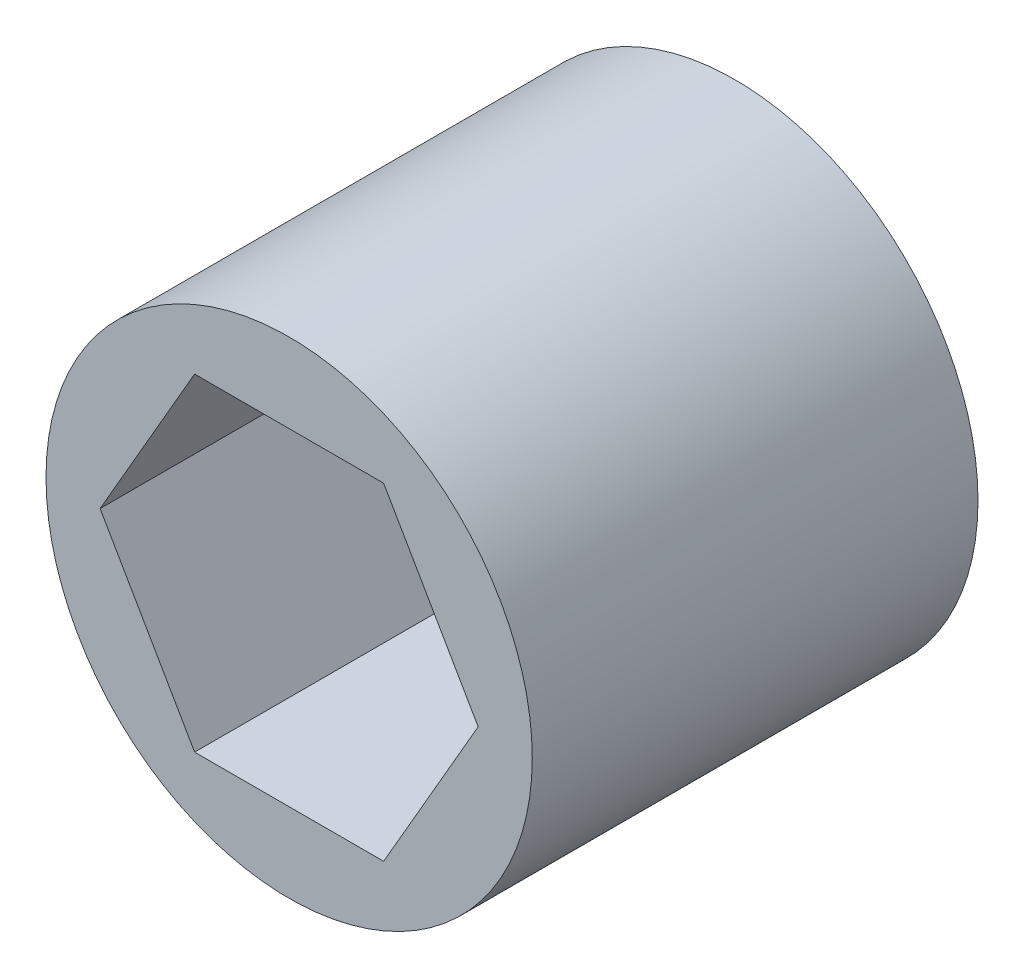
ISO-10303-21;
HEADER;
FILE_DESCRIPTION(('STEP AP214'),'2;1');
FILE_NAME('part.step','',(''),(''),'','','');
FILE_SCHEMA(('AUTOMOTIVE_DESIGN { 1 0 10303 214 1 1 1 1 }'));
ENDSEC;
DATA;
#1=APPLICATION_CONTEXT('core data for automotive mechanical design processes');
#2=APPLICATION_PROTOCOL_DEFINITION('international standard','automotive_design',2000,#1);
#3=PRODUCT_CONTEXT('',#1,'mechanical');
#4=PRODUCT('Part','Part','',(#3));
#5=PRODUCT_RELATED_PRODUCT_CATEGORY('part','',(#4));
#6=PRODUCT_DEFINITION_FORMATION('','',#4);
#7=PRODUCT_DEFINITION_CONTEXT('part definition',#1,'design');
#8=PRODUCT_DEFINITION('design','',#6,#7);
#9=PRODUCT_DEFINITION_SHAPE('','',#8);
#10=(LENGTH_UNIT() NAMED_UNIT(*) SI_UNIT(.MILLI.,.METRE.));
#11=(NAMED_UNIT(*) PLANE_ANGLE_UNIT() SI_UNIT($,.RADIAN.));
#12=(NAMED_UNIT(*) SI_UNIT($,.STERADIAN.) SOLID_ANGLE_UNIT());
#13=UNCERTAINTY_MEASURE_WITH_UNIT(LENGTH_MEASURE(1.E-05),#10,'distance_accuracy_value','');
#14=(GEOMETRIC_REPRESENTATION_CONTEXT(3) GLOBAL_UNCERTAINTY_ASSIGNED_CONTEXT((#13)) GLOBAL_UNIT_ASSIGNED_CONTEXT((#10,
#11,#12)) REPRESENTATION_CONTEXT('',''));
#15=CARTESIAN_POINT('',(0.,0.,0.));
#16=DIRECTION('',(0.,0.,1.));
#17=DIRECTION('',(1.,0.,0.));
#18=AXIS2_PLACEMENT_3D('',#15,#16,#17);
#19=CARTESIAN_POINT('',(0.,0.,17.4625));
#20=DIRECTION('',(0.,0.,-1.));
#21=DIRECTION('',(-1.,0.,0.));
#22=AXIS2_PLACEMENT_3D('',#19,#20,#21);
#23=CYLINDRICAL_SURFACE('',#22,9.525);
#24=CARTESIAN_POINT('',(0.,0.,17.4625));
#25=DIRECTION('',(0.,0.,1.));
#26=DIRECTION('',(1.,0.,0.));
#27=AXIS2_PLACEMENT_3D('',#24,#25,#26);
#28=CIRCLE('',#27,9.525);
#29=CARTESIAN_POINT('',(9.525,0.,17.4625));
#30=VERTEX_POINT('',#29);
#31=EDGE_CURVE('E11',#30,#30,#28,.T.);
#32=ORIENTED_EDGE('',*,*,#31,.F.);
#33=EDGE_LOOP('',(#32));
#34=FACE_BOUND('',#33,.T.);
#35=CARTESIAN_POINT('',(0.,0.,0.));
#36=DIRECTION('',(0.,0.,1.));
#37=DIRECTION('',(1.,0.,0.));
#38=AXIS2_PLACEMENT_3D('',#35,#36,#37);
#39=CIRCLE('',#38,9.525);
#40=CARTESIAN_POINT('',(9.525,0.,0.));
#41=VERTEX_POINT('',#40);
#42=EDGE_CURVE('E20',#41,#41,#39,.T.);
#43=ORIENTED_EDGE('',*,*,#42,.T.);
#44=EDGE_LOOP('',(#43));
#45=FACE_BOUND('',#44,.T.);
#46=ADVANCED_FACE('F17',(#34,#45),#23,.T.);
#47=CARTESIAN_POINT('',(0.,0.,17.4625));
#48=DIRECTION('',(0.,0.,1.));
#49=DIRECTION('',(1.,0.,0.));
#50=AXIS2_PLACEMENT_3D('',#47,#48,#49);
#51=PLANE('',#50);
#52=DIRECTION('',(-0.5,0.866025403784439,0.));
#53=VECTOR('',#52,1.);
#54=CARTESIAN_POINT('',(5.5542539271715,3.20675,17.4625));
#55=LINE('',#54,#53);
#56=CARTESIAN_POINT('',(7.40567190289533,0.,17.4625));
#57=VERTEX_POINT('',#56);
#58=CARTESIAN_POINT('',(3.70283595144766,6.4135,17.4625));
#59=VERTEX_POINT('',#58);
#60=EDGE_CURVE('E87',#57,#59,#55,.T.);
#61=ORIENTED_EDGE('',*,*,#60,.F.);
#62=DIRECTION('',(0.5,0.866025403784438,0.));
#63=VECTOR('',#62,1.);
#64=CARTESIAN_POINT('',(5.5542539271715,-3.20675,17.4625));
#65=LINE('',#64,#63);
#66=CARTESIAN_POINT('',(3.70283595144766,-6.4135,17.4625));
#67=VERTEX_POINT('',#66);
#68=EDGE_CURVE('E112',#67,#57,#65,.T.);
#69=ORIENTED_EDGE('',*,*,#68,.F.);
#70=DIRECTION('',(1.,0.,0.));
#71=VECTOR('',#70,1.);
#72=CARTESIAN_POINT('',(0.,-6.4135,17.4625));
#73=LINE('',#72,#71);
#74=CARTESIAN_POINT('',(-3.70283595144766,-6.4135,17.4625));
#75=VERTEX_POINT('',#74);
#76=EDGE_CURVE('E32',#75,#67,#73,.T.);
#77=ORIENTED_EDGE('',*,*,#76,.F.);
#78=DIRECTION('',(0.5,-0.866025403784439,0.));
#79=VECTOR('',#78,1.);
#80=CARTESIAN_POINT('',(-5.5542539271715,-3.20675,17.4625));
#81=LINE('',#80,#79);
#82=CARTESIAN_POINT('',(-7.40567190289533,0.,17.4625));
#83=VERTEX_POINT('',#82);
#84=EDGE_CURVE('E104',#83,#75,#81,.T.);
#85=ORIENTED_EDGE('',*,*,#84,.F.);
#86=DIRECTION('',(-0.5,-0.866025403784439,0.));
#87=VECTOR('',#86,1.);
#88=CARTESIAN_POINT('',(-5.5542539271715,3.20675,17.4625));
#89=LINE('',#88,#87);
#90=CARTESIAN_POINT('',(-3.70283595144766,6.4135,17.4625));
#91=VERTEX_POINT('',#90);
#92=EDGE_CURVE('E97',#91,#83,#89,.T.);
#93=ORIENTED_EDGE('',*,*,#92,.F.);
#94=DIRECTION('',(-1.,0.,0.));
#95=VECTOR('',#94,1.);
#96=CARTESIAN_POINT('',(0.,6.4135,17.4625));
#97=LINE('',#96,#95);
#98=EDGE_CURVE('E76',#59,#91,#97,.T.);
#99=ORIENTED_EDGE('',*,*,#98,.F.);
#100=EDGE_LOOP('',(#61,#69,#77,#85,#93,#99));
#101=FACE_BOUND('',#100,.T.);
#102=ORIENTED_EDGE('',*,*,#31,.T.);
#103=EDGE_LOOP('',(#102));
#104=FACE_BOUND('',#103,.T.);
#105=ADVANCED_FACE('F93',(#101,#104),#51,.T.);
#106=CARTESIAN_POINT('',(0.,0.,0.));
#107=DIRECTION('',(0.,0.,1.));
#108=DIRECTION('',(1.,0.,0.));
#109=AXIS2_PLACEMENT_3D('',#106,#107,#108);
#110=PLANE('',#109);
#111=DIRECTION('',(-0.5,-0.866025403784439,0.));
#112=VECTOR('',#111,1.);
#113=CARTESIAN_POINT('',(5.5542539271715,-3.20675,0.));
#114=LINE('',#113,#112);
#115=CARTESIAN_POINT('',(7.40567190289533,0.,0.));
#116=VERTEX_POINT('',#115);
#117=CARTESIAN_POINT('',(3.70283595144766,-6.4135,0.));
#118=VERTEX_POINT('',#117);
#119=EDGE_CURVE('E128',#116,#118,#114,.T.);
#120=ORIENTED_EDGE('',*,*,#119,.F.);
#121=DIRECTION('',(0.5,-0.866025403784439,0.));
#122=VECTOR('',#121,1.);
#123=CARTESIAN_POINT('',(5.5542539271715,3.20675,0.));
#124=LINE('',#123,#122);
#125=CARTESIAN_POINT('',(3.70283595144766,6.4135,0.));
#126=VERTEX_POINT('',#125);
#127=EDGE_CURVE('E83',#126,#116,#124,.T.);
#128=ORIENTED_EDGE('',*,*,#127,.F.);
#129=DIRECTION('',(1.,0.,0.));
#130=VECTOR('',#129,1.);
#131=CARTESIAN_POINT('',(0.,6.4135,0.));
#132=LINE('',#131,#130);
#133=CARTESIAN_POINT('',(-3.70283595144766,6.4135,0.));
#134=VERTEX_POINT('',#133);
#135=EDGE_CURVE('E79',#134,#126,#132,.T.);
#136=ORIENTED_EDGE('',*,*,#135,.F.);
#137=DIRECTION('',(0.5,0.866025403784439,0.));
#138=VECTOR('',#137,1.);
#139=CARTESIAN_POINT('',(-5.5542539271715,3.20675,0.));
#140=LINE('',#139,#138);
#141=CARTESIAN_POINT('',(-7.40567190289533,0.,0.));
#142=VERTEX_POINT('',#141);
#143=EDGE_CURVE('E137',#142,#134,#140,.T.);
#144=ORIENTED_EDGE('',*,*,#143,.F.);
#145=DIRECTION('',(-0.5,0.866025403784439,0.));
#146=VECTOR('',#145,1.);
#147=CARTESIAN_POINT('',(-5.5542539271715,-3.20675,0.));
#148=LINE('',#147,#146);
#149=CARTESIAN_POINT('',(-3.70283595144766,-6.4135,0.));
#150=VERTEX_POINT('',#149);
#151=EDGE_CURVE('E134',#150,#142,#148,.T.);
#152=ORIENTED_EDGE('',*,*,#151,.F.);
#153=DIRECTION('',(-1.,0.,0.));
#154=VECTOR('',#153,1.);
#155=CARTESIAN_POINT('',(0.,-6.4135,0.));
#156=LINE('',#155,#154);
#157=EDGE_CURVE('E131',#118,#150,#156,.T.);
#158=ORIENTED_EDGE('',*,*,#157,.F.);
#159=EDGE_LOOP('',(#120,#128,#136,#144,#152,#158));
#160=FACE_BOUND('',#159,.T.);
#161=ORIENTED_EDGE('',*,*,#42,.F.);
#162=EDGE_LOOP('',(#161));
#163=FACE_BOUND('',#162,.T.);
#164=ADVANCED_FACE('F144',(#160,#163),#110,.F.);
#165=CARTESIAN_POINT('',(5.5542539271715,3.20675,-0.00199999999999853));
#166=DIRECTION('',(0.866025403784439,0.5,0.));
#167=DIRECTION('',(-0.5,0.866025403784439,0.));
#168=AXIS2_PLACEMENT_3D('',#165,#166,#167);
#169=PLANE('',#168);
#170=ORIENTED_EDGE('',*,*,#127,.T.);
#171=DIRECTION('',(0.,0.,1.));
#172=VECTOR('',#171,1.);
#173=CARTESIAN_POINT('',(7.40567190289533,0.,-0.00199999999999853));
#174=LINE('',#173,#172);
#175=EDGE_CURVE('E40',#116,#57,#174,.T.);
#176=ORIENTED_EDGE('',*,*,#175,.T.);
#177=ORIENTED_EDGE('',*,*,#60,.T.);
#178=DIRECTION('',(0.,0.,1.));
#179=VECTOR('',#178,1.);
#180=CARTESIAN_POINT('',(3.70283595144766,6.4135,-0.00199999999999853));
#181=LINE('',#180,#179);
#182=EDGE_CURVE('E71',#126,#59,#181,.T.);
#183=ORIENTED_EDGE('',*,*,#182,.F.);
#184=EDGE_LOOP('',(#170,#176,#177,#183));
#185=FACE_BOUND('',#184,.T.);
#186=ADVANCED_FACE('F88',(#185),#169,.F.);
#187=CARTESIAN_POINT('',(0.,6.4135,-0.00199999999999853));
#188=DIRECTION('',(0.,1.,0.));
#189=DIRECTION('',(0.,0.,1.));
#190=AXIS2_PLACEMENT_3D('',#187,#188,#189);
#191=PLANE('',#190);
#192=ORIENTED_EDGE('',*,*,#135,.T.);
#193=ORIENTED_EDGE('',*,*,#182,.T.);
#194=ORIENTED_EDGE('',*,*,#98,.T.);
#195=DIRECTION('',(0.,0.,1.));
#196=VECTOR('',#195,1.);
#197=CARTESIAN_POINT('',(-3.70283595144766,6.4135,-0.00199999999999853));
#198=LINE('',#197,#196);
#199=EDGE_CURVE('E84',#134,#91,#198,.T.);
#200=ORIENTED_EDGE('',*,*,#199,.F.);
#201=EDGE_LOOP('',(#192,#193,#194,#200));
#202=FACE_BOUND('',#201,.T.);
#203=ADVANCED_FACE('F73',(#202),#191,.F.);
#204=CARTESIAN_POINT('',(-5.5542539271715,3.20675,-0.00199999999999853));
#205=DIRECTION('',(-0.866025403784439,0.5,0.));
#206=DIRECTION('',(-0.5,-0.866025403784439,0.));
#207=AXIS2_PLACEMENT_3D('',#204,#205,#206);
#208=PLANE('',#207);
#209=ORIENTED_EDGE('',*,*,#143,.T.);
#210=ORIENTED_EDGE('',*,*,#199,.T.);
#211=ORIENTED_EDGE('',*,*,#92,.T.);
#212=DIRECTION('',(0.,0.,1.));
#213=VECTOR('',#212,1.);
#214=CARTESIAN_POINT('',(-7.40567190289533,0.,-0.00199999999999853));
#215=LINE('',#214,#213);
#216=EDGE_CURVE('E123',#142,#83,#215,.T.);
#217=ORIENTED_EDGE('',*,*,#216,.F.);
#218=EDGE_LOOP('',(#209,#210,#211,#217));
#219=FACE_BOUND('',#218,.T.);
#220=ADVANCED_FACE('F155',(#219),#208,.F.);
#221=CARTESIAN_POINT('',(-5.5542539271715,-3.20675,-0.00199999999999853));
#222=DIRECTION('',(-0.866025403784439,-0.5,0.));
#223=DIRECTION('',(0.5,-0.866025403784439,0.));
#224=AXIS2_PLACEMENT_3D('',#221,#222,#223);
#225=PLANE('',#224);
#226=ORIENTED_EDGE('',*,*,#151,.T.);
#227=ORIENTED_EDGE('',*,*,#216,.T.);
#228=ORIENTED_EDGE('',*,*,#84,.T.);
#229=DIRECTION('',(0.,0.,1.));
#230=VECTOR('',#229,1.);
#231=CARTESIAN_POINT('',(-3.70283595144766,-6.4135,-0.00199999999999853));
#232=LINE('',#231,#230);
#233=EDGE_CURVE('E120',#150,#75,#232,.T.);
#234=ORIENTED_EDGE('',*,*,#233,.F.);
#235=EDGE_LOOP('',(#226,#227,#228,#234));
#236=FACE_BOUND('',#235,.T.);
#237=ADVANCED_FACE('F151',(#236),#225,.F.);
#238=CARTESIAN_POINT('',(0.,-6.4135,-0.00199999999999853));
#239=DIRECTION('',(0.,-1.,0.));
#240=DIRECTION('',(1.,0.,0.));
#241=AXIS2_PLACEMENT_3D('',#238,#239,#240);
#242=PLANE('',#241);
#243=ORIENTED_EDGE('',*,*,#157,.T.);
#244=ORIENTED_EDGE('',*,*,#233,.T.);
#245=ORIENTED_EDGE('',*,*,#76,.T.);
#246=DIRECTION('',(0.,0.,1.));
#247=VECTOR('',#246,1.);
#248=CARTESIAN_POINT('',(3.70283595144766,-6.4135,-0.00199999999999853));
#249=LINE('',#248,#247);
#250=EDGE_CURVE('E117',#118,#67,#249,.T.);
#251=ORIENTED_EDGE('',*,*,#250,.F.);
#252=EDGE_LOOP('',(#243,#244,#245,#251));
#253=FACE_BOUND('',#252,.T.);
#254=ADVANCED_FACE('F148',(#253),#242,.F.);
#255=CARTESIAN_POINT('',(5.5542539271715,-3.20675,-0.00199999999999853));
#256=DIRECTION('',(0.866025403784438,-0.5,0.));
#257=DIRECTION('',(0.5,0.866025403784439,0.));
#258=AXIS2_PLACEMENT_3D('',#255,#256,#257);
#259=PLANE('',#258);
#260=ORIENTED_EDGE('',*,*,#119,.T.);
#261=ORIENTED_EDGE('',*,*,#250,.T.);
#262=ORIENTED_EDGE('',*,*,#68,.T.);
#263=ORIENTED_EDGE('',*,*,#175,.F.);
#264=EDGE_LOOP('',(#260,#261,#262,#263));
#265=FACE_BOUND('',#264,.T.);
#266=ADVANCED_FACE('F147',(#265),#259,.F.);
#267=CLOSED_SHELL('',(#46,#105,#164,#186,#203,#220,#237,#254,#266));
#268=MANIFOLD_SOLID_BREP('B1',#267);
#269=ADVANCED_BREP_SHAPE_REPRESENTATION('',(#18,#268),#14);
#270=SHAPE_DEFINITION_REPRESENTATION(#9,#269);
ENDSEC;
END-ISO-10303-21;
